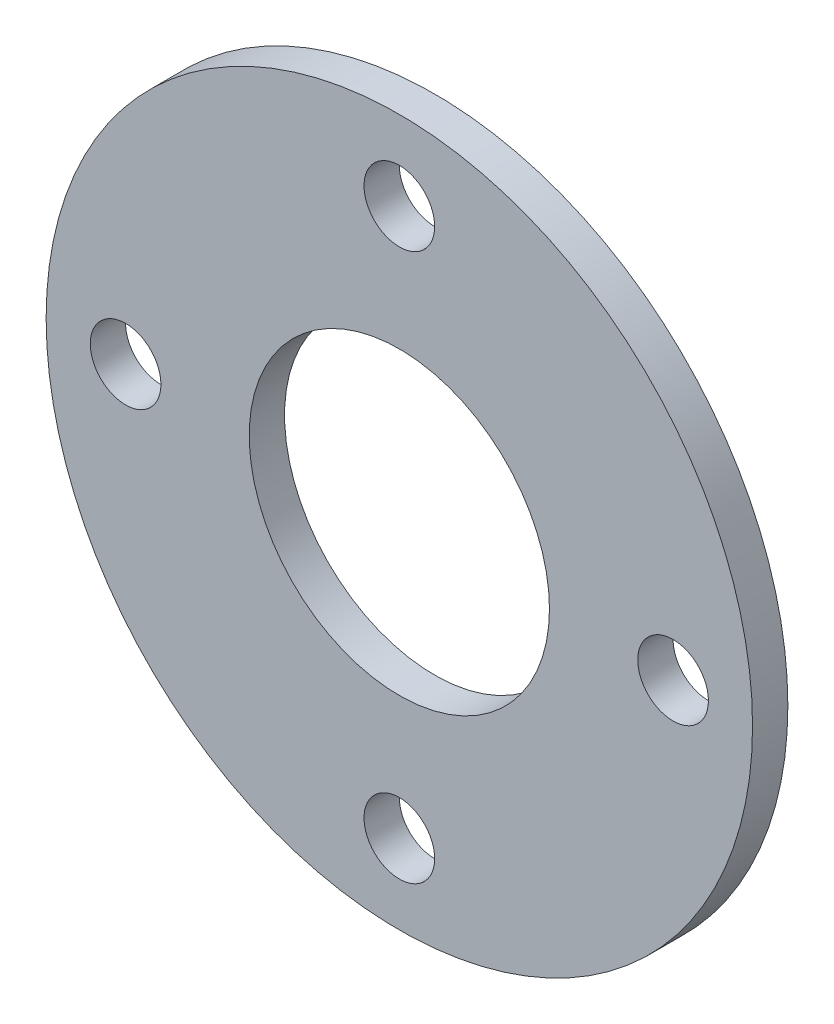
ISO-10303-21;
HEADER;
FILE_DESCRIPTION(('STEP AP214'),'2;1');
FILE_NAME('part.step','',(''),(''),'','','');
FILE_SCHEMA(('AUTOMOTIVE_DESIGN { 1 0 10303 214 1 1 1 1 }'));
ENDSEC;
DATA;
#1=APPLICATION_CONTEXT('core data for automotive mechanical design processes');
#2=APPLICATION_PROTOCOL_DEFINITION('international standard','automotive_design',2000,#1);
#3=PRODUCT_CONTEXT('',#1,'mechanical');
#4=PRODUCT('Part','Part','',(#3));
#5=PRODUCT_RELATED_PRODUCT_CATEGORY('part','',(#4));
#6=PRODUCT_DEFINITION_FORMATION('','',#4);
#7=PRODUCT_DEFINITION_CONTEXT('part definition',#1,'design');
#8=PRODUCT_DEFINITION('design','',#6,#7);
#9=PRODUCT_DEFINITION_SHAPE('','',#8);
#10=(LENGTH_UNIT() NAMED_UNIT(*) SI_UNIT(.MILLI.,.METRE.));
#11=(NAMED_UNIT(*) PLANE_ANGLE_UNIT() SI_UNIT($,.RADIAN.));
#12=(NAMED_UNIT(*) SI_UNIT($,.STERADIAN.) SOLID_ANGLE_UNIT());
#13=UNCERTAINTY_MEASURE_WITH_UNIT(LENGTH_MEASURE(1.E-05),#10,'distance_accuracy_value','');
#14=(GEOMETRIC_REPRESENTATION_CONTEXT(3) GLOBAL_UNCERTAINTY_ASSIGNED_CONTEXT((#13)) GLOBAL_UNIT_ASSIGNED_CONTEXT((#10,
#11,#12)) REPRESENTATION_CONTEXT('',''));
#15=CARTESIAN_POINT('',(0.,0.,0.));
#16=DIRECTION('',(0.,0.,1.));
#17=DIRECTION('',(1.,0.,0.));
#18=AXIS2_PLACEMENT_3D('',#15,#16,#17);
#19=CARTESIAN_POINT('',(0.,0.,2.));
#20=DIRECTION('',(0.,0.,1.));
#21=DIRECTION('',(1.,0.,0.));
#22=AXIS2_PLACEMENT_3D('',#19,#20,#21);
#23=PLANE('',#22);
#24=CARTESIAN_POINT('',(15.5,0.,2.));
#25=DIRECTION('',(0.,0.,1.));
#26=DIRECTION('',(1.,0.,0.));
#27=AXIS2_PLACEMENT_3D('',#24,#25,#26);
#28=CIRCLE('',#27,2.);
#29=CARTESIAN_POINT('',(17.5,0.,2.));
#30=VERTEX_POINT('',#29);
#31=EDGE_CURVE('E60',#30,#30,#28,.T.);
#32=ORIENTED_EDGE('',*,*,#31,.F.);
#33=EDGE_LOOP('',(#32));
#34=FACE_BOUND('',#33,.T.);
#35=CARTESIAN_POINT('',(0.,15.5,2.));
#36=DIRECTION('',(0.,0.,1.));
#37=DIRECTION('',(1.,0.,0.));
#38=AXIS2_PLACEMENT_3D('',#35,#36,#37);
#39=CIRCLE('',#38,2.);
#40=CARTESIAN_POINT('',(2.,15.5,2.));
#41=VERTEX_POINT('',#40);
#42=EDGE_CURVE('E48',#41,#41,#39,.T.);
#43=ORIENTED_EDGE('',*,*,#42,.F.);
#44=EDGE_LOOP('',(#43));
#45=FACE_BOUND('',#44,.T.);
#46=CARTESIAN_POINT('',(0.,0.,2.));
#47=DIRECTION('',(0.,0.,1.));
#48=DIRECTION('',(1.,0.,0.));
#49=AXIS2_PLACEMENT_3D('',#46,#47,#48);
#50=CIRCLE('',#49,20.);
#51=CARTESIAN_POINT('',(20.,0.,2.));
#52=VERTEX_POINT('',#51);
#53=EDGE_CURVE('E10',#52,#52,#50,.T.);
#54=ORIENTED_EDGE('',*,*,#53,.T.);
#55=EDGE_LOOP('',(#54));
#56=FACE_BOUND('',#55,.T.);
#57=CARTESIAN_POINT('',(0.,0.,2.));
#58=DIRECTION('',(0.,0.,1.));
#59=DIRECTION('',(1.,0.,0.));
#60=AXIS2_PLACEMENT_3D('',#57,#58,#59);
#61=CIRCLE('',#60,8.5);
#62=CARTESIAN_POINT('',(8.5,0.,2.));
#63=VERTEX_POINT('',#62);
#64=EDGE_CURVE('E43',#63,#63,#61,.T.);
#65=ORIENTED_EDGE('',*,*,#64,.F.);
#66=EDGE_LOOP('',(#65));
#67=FACE_BOUND('',#66,.T.);
#68=CARTESIAN_POINT('',(0.,-15.5,2.));
#69=DIRECTION('',(0.,0.,1.));
#70=DIRECTION('',(1.,0.,0.));
#71=AXIS2_PLACEMENT_3D('',#68,#69,#70);
#72=CIRCLE('',#71,2.);
#73=CARTESIAN_POINT('',(2.,-15.5,2.));
#74=VERTEX_POINT('',#73);
#75=EDGE_CURVE('E54',#74,#74,#72,.T.);
#76=ORIENTED_EDGE('',*,*,#75,.F.);
#77=EDGE_LOOP('',(#76));
#78=FACE_BOUND('',#77,.T.);
#79=CARTESIAN_POINT('',(-15.5,0.,2.));
#80=DIRECTION('',(0.,0.,1.));
#81=DIRECTION('',(1.,0.,0.));
#82=AXIS2_PLACEMENT_3D('',#79,#80,#81);
#83=CIRCLE('',#82,2.);
#84=CARTESIAN_POINT('',(-13.5,0.,2.));
#85=VERTEX_POINT('',#84);
#86=EDGE_CURVE('E66',#85,#85,#83,.T.);
#87=ORIENTED_EDGE('',*,*,#86,.F.);
#88=EDGE_LOOP('',(#87));
#89=FACE_BOUND('',#88,.T.);
#90=ADVANCED_FACE('F32',(#34,#45,#56,#67,#78,#89),#23,.T.);
#91=CARTESIAN_POINT('',(0.,0.,0.));
#92=DIRECTION('',(0.,0.,1.));
#93=DIRECTION('',(1.,0.,0.));
#94=AXIS2_PLACEMENT_3D('',#91,#92,#93);
#95=PLANE('',#94);
#96=CARTESIAN_POINT('',(0.,0.,0.));
#97=DIRECTION('',(0.,0.,1.));
#98=DIRECTION('',(1.,0.,0.));
#99=AXIS2_PLACEMENT_3D('',#96,#97,#98);
#100=CIRCLE('',#99,20.);
#101=CARTESIAN_POINT('',(20.,0.,0.));
#102=VERTEX_POINT('',#101);
#103=EDGE_CURVE('E36',#102,#102,#100,.T.);
#104=ORIENTED_EDGE('',*,*,#103,.F.);
#105=EDGE_LOOP('',(#104));
#106=FACE_BOUND('',#105,.T.);
#107=CARTESIAN_POINT('',(0.,0.,0.));
#108=DIRECTION('',(0.,0.,1.));
#109=DIRECTION('',(1.,0.,0.));
#110=AXIS2_PLACEMENT_3D('',#107,#108,#109);
#111=CIRCLE('',#110,8.5);
#112=CARTESIAN_POINT('',(8.5,0.,0.));
#113=VERTEX_POINT('',#112);
#114=EDGE_CURVE('E45',#113,#113,#111,.T.);
#115=ORIENTED_EDGE('',*,*,#114,.T.);
#116=EDGE_LOOP('',(#115));
#117=FACE_BOUND('',#116,.T.);
#118=CARTESIAN_POINT('',(0.,15.5,0.));
#119=DIRECTION('',(0.,0.,1.));
#120=DIRECTION('',(1.,0.,0.));
#121=AXIS2_PLACEMENT_3D('',#118,#119,#120);
#122=CIRCLE('',#121,2.);
#123=CARTESIAN_POINT('',(2.,15.5,0.));
#124=VERTEX_POINT('',#123);
#125=EDGE_CURVE('E51',#124,#124,#122,.T.);
#126=ORIENTED_EDGE('',*,*,#125,.T.);
#127=EDGE_LOOP('',(#126));
#128=FACE_BOUND('',#127,.T.);
#129=CARTESIAN_POINT('',(0.,-15.5,0.));
#130=DIRECTION('',(0.,0.,1.));
#131=DIRECTION('',(1.,0.,0.));
#132=AXIS2_PLACEMENT_3D('',#129,#130,#131);
#133=CIRCLE('',#132,2.);
#134=CARTESIAN_POINT('',(2.,-15.5,0.));
#135=VERTEX_POINT('',#134);
#136=EDGE_CURVE('E57',#135,#135,#133,.T.);
#137=ORIENTED_EDGE('',*,*,#136,.T.);
#138=EDGE_LOOP('',(#137));
#139=FACE_BOUND('',#138,.T.);
#140=CARTESIAN_POINT('',(15.5,0.,0.));
#141=DIRECTION('',(0.,0.,1.));
#142=DIRECTION('',(1.,0.,0.));
#143=AXIS2_PLACEMENT_3D('',#140,#141,#142);
#144=CIRCLE('',#143,2.);
#145=CARTESIAN_POINT('',(17.5,0.,0.));
#146=VERTEX_POINT('',#145);
#147=EDGE_CURVE('E63',#146,#146,#144,.T.);
#148=ORIENTED_EDGE('',*,*,#147,.T.);
#149=EDGE_LOOP('',(#148));
#150=FACE_BOUND('',#149,.T.);
#151=CARTESIAN_POINT('',(-15.5,0.,0.));
#152=DIRECTION('',(0.,0.,1.));
#153=DIRECTION('',(1.,0.,0.));
#154=AXIS2_PLACEMENT_3D('',#151,#152,#153);
#155=CIRCLE('',#154,2.);
#156=CARTESIAN_POINT('',(-13.5,0.,0.));
#157=VERTEX_POINT('',#156);
#158=EDGE_CURVE('E69',#157,#157,#155,.T.);
#159=ORIENTED_EDGE('',*,*,#158,.T.);
#160=EDGE_LOOP('',(#159));
#161=FACE_BOUND('',#160,.T.);
#162=ADVANCED_FACE('F79',(#106,#117,#128,#139,#150,#161),#95,.F.);
#163=CARTESIAN_POINT('',(0.,0.,2.));
#164=DIRECTION('',(0.,0.,-1.));
#165=DIRECTION('',(-1.,0.,0.));
#166=AXIS2_PLACEMENT_3D('',#163,#164,#165);
#167=CYLINDRICAL_SURFACE('',#166,20.);
#168=ORIENTED_EDGE('',*,*,#53,.F.);
#169=EDGE_LOOP('',(#168));
#170=FACE_BOUND('',#169,.T.);
#171=ORIENTED_EDGE('',*,*,#103,.T.);
#172=EDGE_LOOP('',(#171));
#173=FACE_BOUND('',#172,.T.);
#174=ADVANCED_FACE('F34',(#170,#173),#167,.T.);
#175=CARTESIAN_POINT('',(0.,0.,2.));
#176=DIRECTION('',(0.,0.,-1.));
#177=DIRECTION('',(-1.,0.,0.));
#178=AXIS2_PLACEMENT_3D('',#175,#176,#177);
#179=CYLINDRICAL_SURFACE('',#178,8.5);
#180=ORIENTED_EDGE('',*,*,#64,.T.);
#181=EDGE_LOOP('',(#180));
#182=FACE_BOUND('',#181,.T.);
#183=ORIENTED_EDGE('',*,*,#114,.F.);
#184=EDGE_LOOP('',(#183));
#185=FACE_BOUND('',#184,.T.);
#186=ADVANCED_FACE('F89',(#182,#185),#179,.F.);
#187=CARTESIAN_POINT('',(0.,15.5,2.));
#188=DIRECTION('',(0.,0.,-1.));
#189=DIRECTION('',(-1.,0.,0.));
#190=AXIS2_PLACEMENT_3D('',#187,#188,#189);
#191=CYLINDRICAL_SURFACE('',#190,2.);
#192=ORIENTED_EDGE('',*,*,#42,.T.);
#193=EDGE_LOOP('',(#192));
#194=FACE_BOUND('',#193,.T.);
#195=ORIENTED_EDGE('',*,*,#125,.F.);
#196=EDGE_LOOP('',(#195));
#197=FACE_BOUND('',#196,.T.);
#198=ADVANCED_FACE('F92',(#194,#197),#191,.F.);
#199=CARTESIAN_POINT('',(0.,-15.5,2.));
#200=DIRECTION('',(0.,0.,-1.));
#201=DIRECTION('',(-1.,0.,0.));
#202=AXIS2_PLACEMENT_3D('',#199,#200,#201);
#203=CYLINDRICAL_SURFACE('',#202,2.);
#204=ORIENTED_EDGE('',*,*,#75,.T.);
#205=EDGE_LOOP('',(#204));
#206=FACE_BOUND('',#205,.T.);
#207=ORIENTED_EDGE('',*,*,#136,.F.);
#208=EDGE_LOOP('',(#207));
#209=FACE_BOUND('',#208,.T.);
#210=ADVANCED_FACE('F96',(#206,#209),#203,.F.);
#211=CARTESIAN_POINT('',(15.5,0.,2.));
#212=DIRECTION('',(0.,0.,-1.));
#213=DIRECTION('',(-1.,0.,0.));
#214=AXIS2_PLACEMENT_3D('',#211,#212,#213);
#215=CYLINDRICAL_SURFACE('',#214,2.);
#216=ORIENTED_EDGE('',*,*,#31,.T.);
#217=EDGE_LOOP('',(#216));
#218=FACE_BOUND('',#217,.T.);
#219=ORIENTED_EDGE('',*,*,#147,.F.);
#220=EDGE_LOOP('',(#219));
#221=FACE_BOUND('',#220,.T.);
#222=ADVANCED_FACE('F100',(#218,#221),#215,.F.);
#223=CARTESIAN_POINT('',(-15.5,0.,2.));
#224=DIRECTION('',(0.,0.,-1.));
#225=DIRECTION('',(-1.,0.,0.));
#226=AXIS2_PLACEMENT_3D('',#223,#224,#225);
#227=CYLINDRICAL_SURFACE('',#226,2.);
#228=ORIENTED_EDGE('',*,*,#86,.T.);
#229=EDGE_LOOP('',(#228));
#230=FACE_BOUND('',#229,.T.);
#231=ORIENTED_EDGE('',*,*,#158,.F.);
#232=EDGE_LOOP('',(#231));
#233=FACE_BOUND('',#232,.T.);
#234=ADVANCED_FACE('F75',(#230,#233),#227,.F.);
#235=CLOSED_SHELL('',(#90,#162,#174,#186,#198,#210,#222,#234));
#236=MANIFOLD_SOLID_BREP('B2',#235);
#237=ADVANCED_BREP_SHAPE_REPRESENTATION('',(#18,#236),#14);
#238=SHAPE_DEFINITION_REPRESENTATION(#9,#237);
ENDSEC;
END-ISO-10303-21;
